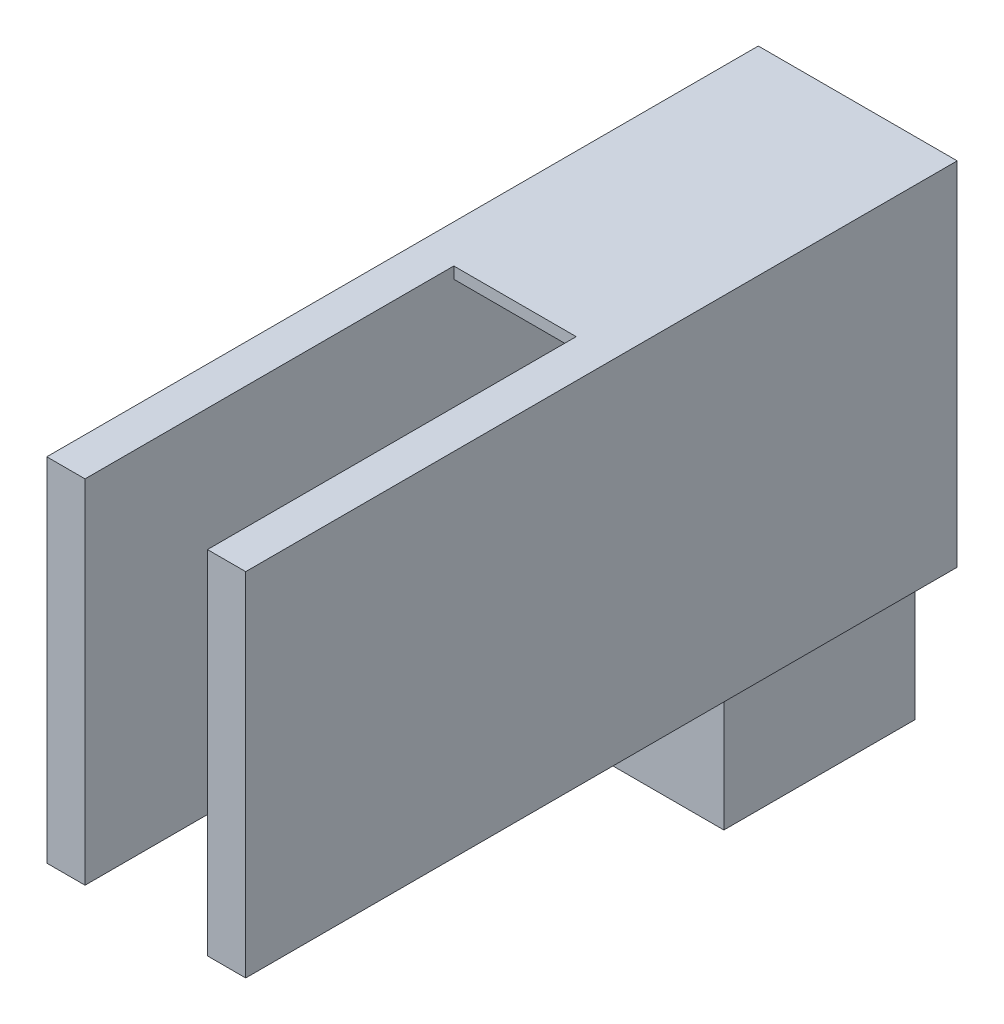
ISO-10303-21;
HEADER;
FILE_DESCRIPTION(('STEP AP214'),'2;1');
FILE_NAME('part.step','',(''),(''),'','','');
FILE_SCHEMA(('AUTOMOTIVE_DESIGN { 1 0 10303 214 1 1 1 1 }'));
ENDSEC;
DATA;
#1=APPLICATION_CONTEXT('core data for automotive mechanical design processes');
#2=APPLICATION_PROTOCOL_DEFINITION('international standard','automotive_design',2000,#1);
#3=PRODUCT_CONTEXT('',#1,'mechanical');
#4=PRODUCT('Part','Part','',(#3));
#5=PRODUCT_RELATED_PRODUCT_CATEGORY('part','',(#4));
#6=PRODUCT_DEFINITION_FORMATION('','',#4);
#7=PRODUCT_DEFINITION_CONTEXT('part definition',#1,'design');
#8=PRODUCT_DEFINITION('design','',#6,#7);
#9=PRODUCT_DEFINITION_SHAPE('','',#8);
#10=(LENGTH_UNIT() NAMED_UNIT(*) SI_UNIT(.MILLI.,.METRE.));
#11=(NAMED_UNIT(*) PLANE_ANGLE_UNIT() SI_UNIT($,.RADIAN.));
#12=(NAMED_UNIT(*) SI_UNIT($,.STERADIAN.) SOLID_ANGLE_UNIT());
#13=UNCERTAINTY_MEASURE_WITH_UNIT(LENGTH_MEASURE(1.E-05),#10,'distance_accuracy_value','');
#14=(GEOMETRIC_REPRESENTATION_CONTEXT(3) GLOBAL_UNCERTAINTY_ASSIGNED_CONTEXT((#13)) GLOBAL_UNIT_ASSIGNED_CONTEXT((#10,
#11,#12)) REPRESENTATION_CONTEXT('',''));
#15=CARTESIAN_POINT('',(0.,0.,0.));
#16=DIRECTION('',(0.,0.,1.));
#17=DIRECTION('',(1.,0.,0.));
#18=AXIS2_PLACEMENT_3D('',#15,#16,#17);
#19=CARTESIAN_POINT('',(-13.,-23.,93.));
#20=DIRECTION('',(0.,1.,0.));
#21=DIRECTION('',(0.,0.,1.));
#22=AXIS2_PLACEMENT_3D('',#19,#20,#21);
#23=PLANE('',#22);
#24=DIRECTION('',(0.,0.,1.));
#25=VECTOR('',#24,1.);
#26=CARTESIAN_POINT('',(7.5,-23.,25.));
#27=LINE('',#26,#25);
#28=CARTESIAN_POINT('',(7.49999999999998,-23.,0.));
#29=VERTEX_POINT('',#28);
#30=CARTESIAN_POINT('',(7.5,-23.,20.));
#31=VERTEX_POINT('',#30);
#32=EDGE_CURVE('E51',#29,#31,#27,.T.);
#33=ORIENTED_EDGE('',*,*,#32,.F.);
#34=DIRECTION('',(1.,0.,0.));
#35=VECTOR('',#34,1.);
#36=CARTESIAN_POINT('',(-13.,-23.,0.));
#37=LINE('',#36,#35);
#38=CARTESIAN_POINT('',(13.,-23.,0.));
#39=VERTEX_POINT('',#38);
#40=EDGE_CURVE('E241',#29,#39,#37,.T.);
#41=ORIENTED_EDGE('',*,*,#40,.T.);
#42=DIRECTION('',(0.,0.,-1.));
#43=VECTOR('',#42,1.);
#44=CARTESIAN_POINT('',(13.,-23.,93.));
#45=LINE('',#44,#43);
#46=CARTESIAN_POINT('',(13.,-23.,93.));
#47=VERTEX_POINT('',#46);
#48=EDGE_CURVE('E234',#47,#39,#45,.T.);
#49=ORIENTED_EDGE('',*,*,#48,.F.);
#50=DIRECTION('',(1.,0.,0.));
#51=VECTOR('',#50,1.);
#52=CARTESIAN_POINT('',(-13.,-23.,93.));
#53=LINE('',#52,#51);
#54=CARTESIAN_POINT('',(7.99999999999999,-23.,93.));
#55=VERTEX_POINT('',#54);
#56=EDGE_CURVE('E230',#55,#47,#53,.T.);
#57=ORIENTED_EDGE('',*,*,#56,.F.);
#58=DIRECTION('',(0.,0.,-1.));
#59=VECTOR('',#58,1.);
#60=CARTESIAN_POINT('',(8.,-23.,93.));
#61=LINE('',#60,#59);
#62=CARTESIAN_POINT('',(8.,-23.,20.));
#63=VERTEX_POINT('',#62);
#64=EDGE_CURVE('E173',#55,#63,#61,.T.);
#65=ORIENTED_EDGE('',*,*,#64,.T.);
#66=DIRECTION('',(1.,0.,0.));
#67=VECTOR('',#66,1.);
#68=CARTESIAN_POINT('',(-8.,-23.,20.));
#69=LINE('',#68,#67);
#70=EDGE_CURVE('E195',#31,#63,#69,.T.);
#71=ORIENTED_EDGE('',*,*,#70,.F.);
#72=EDGE_LOOP('',(#33,#41,#49,#57,#65,#71));
#73=FACE_BOUND('',#72,.T.);
#74=ADVANCED_FACE('F33',(#73),#23,.F.);
#75=CARTESIAN_POINT('',(0.,0.,93.));
#76=DIRECTION('',(0.,0.,1.));
#77=DIRECTION('',(1.,0.,0.));
#78=AXIS2_PLACEMENT_3D('',#75,#76,#77);
#79=PLANE('',#78);
#80=DIRECTION('',(-1.,0.,0.));
#81=VECTOR('',#80,1.);
#82=CARTESIAN_POINT('',(-13.,23.,93.));
#83=LINE('',#82,#81);
#84=CARTESIAN_POINT('',(13.,23.,93.));
#85=VERTEX_POINT('',#84);
#86=CARTESIAN_POINT('',(8.,23.,93.));
#87=VERTEX_POINT('',#86);
#88=EDGE_CURVE('E225',#85,#87,#83,.T.);
#89=ORIENTED_EDGE('',*,*,#88,.T.);
#90=DIRECTION('',(0.,-1.,0.));
#91=VECTOR('',#90,1.);
#92=CARTESIAN_POINT('',(8.,-23.,93.));
#93=LINE('',#92,#91);
#94=EDGE_CURVE('E170',#87,#55,#93,.T.);
#95=ORIENTED_EDGE('',*,*,#94,.T.);
#96=ORIENTED_EDGE('',*,*,#56,.T.);
#97=DIRECTION('',(0.,1.,0.));
#98=VECTOR('',#97,1.);
#99=CARTESIAN_POINT('',(13.,23.,93.));
#100=LINE('',#99,#98);
#101=EDGE_CURVE('E221',#47,#85,#100,.T.);
#102=ORIENTED_EDGE('',*,*,#101,.T.);
#103=EDGE_LOOP('',(#89,#95,#96,#102));
#104=FACE_BOUND('',#103,.T.);
#105=ADVANCED_FACE('F270',(#104),#79,.T.);
#106=CARTESIAN_POINT('',(13.,23.,93.));
#107=DIRECTION('',(-1.,0.,0.));
#108=DIRECTION('',(0.,-1.,0.));
#109=AXIS2_PLACEMENT_3D('',#106,#107,#108);
#110=PLANE('',#109);
#111=DIRECTION('',(0.,1.,0.));
#112=VECTOR('',#111,1.);
#113=CARTESIAN_POINT('',(13.,23.,0.));
#114=LINE('',#113,#112);
#115=CARTESIAN_POINT('',(13.,23.,0.));
#116=VERTEX_POINT('',#115);
#117=EDGE_CURVE('E212',#39,#116,#114,.T.);
#118=ORIENTED_EDGE('',*,*,#117,.T.);
#119=DIRECTION('',(0.,0.,-1.));
#120=VECTOR('',#119,1.);
#121=CARTESIAN_POINT('',(13.,23.,93.));
#122=LINE('',#121,#120);
#123=EDGE_CURVE('E11',#85,#116,#122,.T.);
#124=ORIENTED_EDGE('',*,*,#123,.F.);
#125=ORIENTED_EDGE('',*,*,#101,.F.);
#126=ORIENTED_EDGE('',*,*,#48,.T.);
#127=EDGE_LOOP('',(#118,#124,#125,#126));
#128=FACE_BOUND('',#127,.T.);
#129=ADVANCED_FACE('F35',(#128),#110,.F.);
#130=CARTESIAN_POINT('',(-13.,23.,93.));
#131=DIRECTION('',(0.,-1.,0.));
#132=DIRECTION('',(0.,0.,-1.));
#133=AXIS2_PLACEMENT_3D('',#130,#131,#132);
#134=PLANE('',#133);
#135=CARTESIAN_POINT('',(-8.,23.,93.));
#136=VERTEX_POINT('',#135);
#137=CARTESIAN_POINT('',(-13.,23.,93.));
#138=VERTEX_POINT('',#137);
#139=EDGE_CURVE('E224',#136,#138,#83,.T.);
#140=ORIENTED_EDGE('',*,*,#139,.F.);
#141=DIRECTION('',(0.,0.,1.));
#142=VECTOR('',#141,1.);
#143=CARTESIAN_POINT('',(-8.,23.,93.));
#144=LINE('',#143,#142);
#145=CARTESIAN_POINT('',(-8.,23.,44.8));
#146=VERTEX_POINT('',#145);
#147=EDGE_CURVE('E194',#146,#136,#144,.T.);
#148=ORIENTED_EDGE('',*,*,#147,.F.);
#149=DIRECTION('',(1.,0.,0.));
#150=VECTOR('',#149,1.);
#151=CARTESIAN_POINT('',(-8.,23.,44.8));
#152=LINE('',#151,#150);
#153=CARTESIAN_POINT('',(8.,23.,44.8));
#154=VERTEX_POINT('',#153);
#155=EDGE_CURVE('E209',#146,#154,#152,.T.);
#156=ORIENTED_EDGE('',*,*,#155,.T.);
#157=DIRECTION('',(0.,0.,1.));
#158=VECTOR('',#157,1.);
#159=CARTESIAN_POINT('',(8.,23.,93.));
#160=LINE('',#159,#158);
#161=EDGE_CURVE('E182',#154,#87,#160,.T.);
#162=ORIENTED_EDGE('',*,*,#161,.T.);
#163=ORIENTED_EDGE('',*,*,#88,.F.);
#164=ORIENTED_EDGE('',*,*,#123,.T.);
#165=DIRECTION('',(-1.,0.,0.));
#166=VECTOR('',#165,1.);
#167=CARTESIAN_POINT('',(-13.,23.,0.));
#168=LINE('',#167,#166);
#169=CARTESIAN_POINT('',(-13.,23.,0.));
#170=VERTEX_POINT('',#169);
#171=EDGE_CURVE('E237',#116,#170,#168,.T.);
#172=ORIENTED_EDGE('',*,*,#171,.T.);
#173=DIRECTION('',(0.,0.,-1.));
#174=VECTOR('',#173,1.);
#175=CARTESIAN_POINT('',(-13.,23.,93.));
#176=LINE('',#175,#174);
#177=EDGE_CURVE('E43',#138,#170,#176,.T.);
#178=ORIENTED_EDGE('',*,*,#177,.F.);
#179=EDGE_LOOP('',(#140,#148,#156,#162,#163,#164,#172,#178));
#180=FACE_BOUND('',#179,.T.);
#181=ADVANCED_FACE('F267',(#180),#134,.F.);
#182=CARTESIAN_POINT('',(-13.,23.,93.));
#183=DIRECTION('',(1.,0.,0.));
#184=DIRECTION('',(0.,1.,0.));
#185=AXIS2_PLACEMENT_3D('',#182,#183,#184);
#186=PLANE('',#185);
#187=DIRECTION('',(0.,-1.,0.));
#188=VECTOR('',#187,1.);
#189=CARTESIAN_POINT('',(-13.,23.,0.));
#190=LINE('',#189,#188);
#191=CARTESIAN_POINT('',(-13.,-23.,0.));
#192=VERTEX_POINT('',#191);
#193=EDGE_CURVE('E239',#170,#192,#190,.T.);
#194=ORIENTED_EDGE('',*,*,#193,.T.);
#195=DIRECTION('',(0.,0.,-1.));
#196=VECTOR('',#195,1.);
#197=CARTESIAN_POINT('',(-13.,-23.,93.));
#198=LINE('',#197,#196);
#199=CARTESIAN_POINT('',(-13.,-23.,93.));
#200=VERTEX_POINT('',#199);
#201=EDGE_CURVE('E251',#200,#192,#198,.T.);
#202=ORIENTED_EDGE('',*,*,#201,.F.);
#203=DIRECTION('',(0.,-1.,0.));
#204=VECTOR('',#203,1.);
#205=CARTESIAN_POINT('',(-13.,23.,93.));
#206=LINE('',#205,#204);
#207=EDGE_CURVE('E228',#138,#200,#206,.T.);
#208=ORIENTED_EDGE('',*,*,#207,.F.);
#209=ORIENTED_EDGE('',*,*,#177,.T.);
#210=EDGE_LOOP('',(#194,#202,#208,#209));
#211=FACE_BOUND('',#210,.T.);
#212=ADVANCED_FACE('F309',(#211),#186,.F.);
#213=CARTESIAN_POINT('',(-7.5,-23.,0.));
#214=VERTEX_POINT('',#213);
#215=EDGE_CURVE('E59',#192,#214,#37,.T.);
#216=ORIENTED_EDGE('',*,*,#215,.T.);
#217=DIRECTION('',(0.,0.,1.));
#218=VECTOR('',#217,1.);
#219=CARTESIAN_POINT('',(-7.5,-23.,25.));
#220=LINE('',#219,#218);
#221=CARTESIAN_POINT('',(-7.5,-23.,20.));
#222=VERTEX_POINT('',#221);
#223=EDGE_CURVE('E37',#214,#222,#220,.T.);
#224=ORIENTED_EDGE('',*,*,#223,.T.);
#225=CARTESIAN_POINT('',(-8.,-23.,20.));
#226=VERTEX_POINT('',#225);
#227=EDGE_CURVE('E217',#226,#222,#69,.T.);
#228=ORIENTED_EDGE('',*,*,#227,.F.);
#229=DIRECTION('',(0.,0.,-1.));
#230=VECTOR('',#229,1.);
#231=CARTESIAN_POINT('',(-8.,-23.,93.));
#232=LINE('',#231,#230);
#233=CARTESIAN_POINT('',(-8.,-23.,93.));
#234=VERTEX_POINT('',#233);
#235=EDGE_CURVE('E181',#234,#226,#232,.T.);
#236=ORIENTED_EDGE('',*,*,#235,.F.);
#237=EDGE_CURVE('E231',#200,#234,#53,.T.);
#238=ORIENTED_EDGE('',*,*,#237,.F.);
#239=ORIENTED_EDGE('',*,*,#201,.T.);
#240=EDGE_LOOP('',(#216,#224,#228,#236,#238,#239));
#241=FACE_BOUND('',#240,.T.);
#242=ADVANCED_FACE('F301',(#241),#23,.F.);
#243=DIRECTION('',(0.,-1.,0.));
#244=VECTOR('',#243,1.);
#245=CARTESIAN_POINT('',(-8.,-23.,93.));
#246=LINE('',#245,#244);
#247=EDGE_CURVE('E179',#136,#234,#246,.T.);
#248=ORIENTED_EDGE('',*,*,#247,.F.);
#249=ORIENTED_EDGE('',*,*,#139,.T.);
#250=ORIENTED_EDGE('',*,*,#207,.T.);
#251=ORIENTED_EDGE('',*,*,#237,.T.);
#252=EDGE_LOOP('',(#248,#249,#250,#251));
#253=FACE_BOUND('',#252,.T.);
#254=ADVANCED_FACE('F306',(#253),#79,.T.);
#255=CARTESIAN_POINT('',(0.,0.,0.));
#256=DIRECTION('',(0.,0.,1.));
#257=DIRECTION('',(1.,0.,0.));
#258=AXIS2_PLACEMENT_3D('',#255,#256,#257);
#259=PLANE('',#258);
#260=ORIENTED_EDGE('',*,*,#117,.F.);
#261=ORIENTED_EDGE('',*,*,#40,.F.);
#262=DIRECTION('',(0.,1.,0.));
#263=VECTOR('',#262,1.);
#264=CARTESIAN_POINT('',(7.5,-23.,0.));
#265=LINE('',#264,#263);
#266=CARTESIAN_POINT('',(7.5,-43.,0.));
#267=VERTEX_POINT('',#266);
#268=EDGE_CURVE('E156',#267,#29,#265,.T.);
#269=ORIENTED_EDGE('',*,*,#268,.F.);
#270=DIRECTION('',(-1.,0.,0.));
#271=VECTOR('',#270,1.);
#272=CARTESIAN_POINT('',(7.5,-43.,0.));
#273=LINE('',#272,#271);
#274=CARTESIAN_POINT('',(-7.5,-43.,0.));
#275=VERTEX_POINT('',#274);
#276=EDGE_CURVE('E152',#267,#275,#273,.T.);
#277=ORIENTED_EDGE('',*,*,#276,.T.);
#278=DIRECTION('',(0.,1.,0.));
#279=VECTOR('',#278,1.);
#280=CARTESIAN_POINT('',(-7.5,-23.,0.));
#281=LINE('',#280,#279);
#282=EDGE_CURVE('E289',#275,#214,#281,.T.);
#283=ORIENTED_EDGE('',*,*,#282,.T.);
#284=ORIENTED_EDGE('',*,*,#215,.F.);
#285=ORIENTED_EDGE('',*,*,#193,.F.);
#286=ORIENTED_EDGE('',*,*,#171,.F.);
#287=EDGE_LOOP('',(#260,#261,#269,#277,#283,#284,#285,#286));
#288=FACE_BOUND('',#287,.T.);
#289=ADVANCED_FACE('F262',(#288),#259,.F.);
#290=CARTESIAN_POINT('',(-8.,23.,44.8));
#291=DIRECTION('',(0.,0.,-1.));
#292=DIRECTION('',(-1.,0.,0.));
#293=AXIS2_PLACEMENT_3D('',#290,#291,#292);
#294=PLANE('',#293);
#295=DIRECTION('',(0.,1.,0.));
#296=VECTOR('',#295,1.);
#297=CARTESIAN_POINT('',(8.,23.,44.8));
#298=LINE('',#297,#296);
#299=CARTESIAN_POINT('',(8.,21.5,44.8));
#300=VERTEX_POINT('',#299);
#301=EDGE_CURVE('E205',#300,#154,#298,.T.);
#302=ORIENTED_EDGE('',*,*,#301,.T.);
#303=ORIENTED_EDGE('',*,*,#155,.F.);
#304=DIRECTION('',(0.,1.,0.));
#305=VECTOR('',#304,1.);
#306=CARTESIAN_POINT('',(-8.,23.,44.8));
#307=LINE('',#306,#305);
#308=CARTESIAN_POINT('',(-8.,21.5,44.8));
#309=VERTEX_POINT('',#308);
#310=EDGE_CURVE('E191',#309,#146,#307,.T.);
#311=ORIENTED_EDGE('',*,*,#310,.F.);
#312=DIRECTION('',(1.,0.,0.));
#313=VECTOR('',#312,1.);
#314=CARTESIAN_POINT('',(-8.,21.5,44.8));
#315=LINE('',#314,#313);
#316=EDGE_CURVE('E213',#309,#300,#315,.T.);
#317=ORIENTED_EDGE('',*,*,#316,.T.);
#318=EDGE_LOOP('',(#302,#303,#311,#317));
#319=FACE_BOUND('',#318,.T.);
#320=ADVANCED_FACE('F314',(#319),#294,.F.);
#321=CARTESIAN_POINT('',(-8.,21.5,44.8));
#322=DIRECTION('',(0.,1.,0.));
#323=DIRECTION('',(0.,0.,1.));
#324=AXIS2_PLACEMENT_3D('',#321,#322,#323);
#325=PLANE('',#324);
#326=DIRECTION('',(0.,0.,1.));
#327=VECTOR('',#326,1.);
#328=CARTESIAN_POINT('',(8.,21.5,44.8));
#329=LINE('',#328,#327);
#330=CARTESIAN_POINT('',(8.,21.5,20.));
#331=VERTEX_POINT('',#330);
#332=EDGE_CURVE('E202',#331,#300,#329,.T.);
#333=ORIENTED_EDGE('',*,*,#332,.T.);
#334=ORIENTED_EDGE('',*,*,#316,.F.);
#335=DIRECTION('',(0.,0.,1.));
#336=VECTOR('',#335,1.);
#337=CARTESIAN_POINT('',(-8.,21.5,44.8));
#338=LINE('',#337,#336);
#339=CARTESIAN_POINT('',(-8.,21.5,20.));
#340=VERTEX_POINT('',#339);
#341=EDGE_CURVE('E188',#340,#309,#338,.T.);
#342=ORIENTED_EDGE('',*,*,#341,.F.);
#343=DIRECTION('',(1.,0.,0.));
#344=VECTOR('',#343,1.);
#345=CARTESIAN_POINT('',(-8.,21.5,20.));
#346=LINE('',#345,#344);
#347=EDGE_CURVE('E215',#340,#331,#346,.T.);
#348=ORIENTED_EDGE('',*,*,#347,.T.);
#349=EDGE_LOOP('',(#333,#334,#342,#348));
#350=FACE_BOUND('',#349,.T.);
#351=ADVANCED_FACE('F316',(#350),#325,.F.);
#352=CARTESIAN_POINT('',(-8.,-23.,20.));
#353=DIRECTION('',(0.,0.,-1.));
#354=DIRECTION('',(-1.,0.,0.));
#355=AXIS2_PLACEMENT_3D('',#352,#353,#354);
#356=PLANE('',#355);
#357=DIRECTION('',(0.,1.,0.));
#358=VECTOR('',#357,1.);
#359=CARTESIAN_POINT('',(8.,-23.,20.));
#360=LINE('',#359,#358);
#361=EDGE_CURVE('E199',#63,#331,#360,.T.);
#362=ORIENTED_EDGE('',*,*,#361,.T.);
#363=ORIENTED_EDGE('',*,*,#347,.F.);
#364=DIRECTION('',(0.,1.,0.));
#365=VECTOR('',#364,1.);
#366=CARTESIAN_POINT('',(-8.,-23.,20.));
#367=LINE('',#366,#365);
#368=EDGE_CURVE('E185',#226,#340,#367,.T.);
#369=ORIENTED_EDGE('',*,*,#368,.F.);
#370=ORIENTED_EDGE('',*,*,#227,.T.);
#371=EDGE_CURVE('E220',#222,#31,#69,.T.);
#372=ORIENTED_EDGE('',*,*,#371,.T.);
#373=ORIENTED_EDGE('',*,*,#70,.T.);
#374=EDGE_LOOP('',(#362,#363,#369,#370,#372,#373));
#375=FACE_BOUND('',#374,.T.);
#376=ADVANCED_FACE('F277',(#375),#356,.F.);
#377=CARTESIAN_POINT('',(-8.,0.,0.));
#378=DIRECTION('',(-1.,0.,0.));
#379=DIRECTION('',(0.,0.,1.));
#380=AXIS2_PLACEMENT_3D('',#377,#378,#379);
#381=PLANE('',#380);
#382=ORIENTED_EDGE('',*,*,#247,.T.);
#383=ORIENTED_EDGE('',*,*,#235,.T.);
#384=ORIENTED_EDGE('',*,*,#368,.T.);
#385=ORIENTED_EDGE('',*,*,#341,.T.);
#386=ORIENTED_EDGE('',*,*,#310,.T.);
#387=ORIENTED_EDGE('',*,*,#147,.T.);
#388=EDGE_LOOP('',(#382,#383,#384,#385,#386,#387));
#389=FACE_BOUND('',#388,.T.);
#390=ADVANCED_FACE('F311',(#389),#381,.F.);
#391=CARTESIAN_POINT('',(8.,0.,0.));
#392=DIRECTION('',(-1.,0.,0.));
#393=DIRECTION('',(0.,0.,1.));
#394=AXIS2_PLACEMENT_3D('',#391,#392,#393);
#395=PLANE('',#394);
#396=ORIENTED_EDGE('',*,*,#94,.F.);
#397=ORIENTED_EDGE('',*,*,#161,.F.);
#398=ORIENTED_EDGE('',*,*,#301,.F.);
#399=ORIENTED_EDGE('',*,*,#332,.F.);
#400=ORIENTED_EDGE('',*,*,#361,.F.);
#401=ORIENTED_EDGE('',*,*,#64,.F.);
#402=EDGE_LOOP('',(#396,#397,#398,#399,#400,#401));
#403=FACE_BOUND('',#402,.T.);
#404=ADVANCED_FACE('F273',(#403),#395,.T.);
#405=CARTESIAN_POINT('',(7.5,-23.,25.));
#406=DIRECTION('',(0.,0.,-1.));
#407=DIRECTION('',(0.,1.,0.));
#408=AXIS2_PLACEMENT_3D('',#405,#406,#407);
#409=PLANE('',#408);
#410=DIRECTION('',(0.,-1.,0.));
#411=VECTOR('',#410,1.);
#412=CARTESIAN_POINT('',(-7.5,-23.,25.));
#413=LINE('',#412,#411);
#414=CARTESIAN_POINT('',(-7.5,-23.,25.));
#415=VERTEX_POINT('',#414);
#416=CARTESIAN_POINT('',(-7.5,-43.,25.));
#417=VERTEX_POINT('',#416);
#418=EDGE_CURVE('E169',#415,#417,#413,.T.);
#419=ORIENTED_EDGE('',*,*,#418,.T.);
#420=DIRECTION('',(-1.,0.,0.));
#421=VECTOR('',#420,1.);
#422=CARTESIAN_POINT('',(7.5,-43.,25.));
#423=LINE('',#422,#421);
#424=CARTESIAN_POINT('',(7.5,-43.,25.));
#425=VERTEX_POINT('',#424);
#426=EDGE_CURVE('E149',#425,#417,#423,.T.);
#427=ORIENTED_EDGE('',*,*,#426,.F.);
#428=DIRECTION('',(0.,-1.,0.));
#429=VECTOR('',#428,1.);
#430=CARTESIAN_POINT('',(7.5,-23.,25.));
#431=LINE('',#430,#429);
#432=CARTESIAN_POINT('',(7.5,-23.,25.));
#433=VERTEX_POINT('',#432);
#434=EDGE_CURVE('E157',#433,#425,#431,.T.);
#435=ORIENTED_EDGE('',*,*,#434,.F.);
#436=DIRECTION('',(-1.,0.,0.));
#437=VECTOR('',#436,1.);
#438=CARTESIAN_POINT('',(7.5,-23.,25.));
#439=LINE('',#438,#437);
#440=EDGE_CURVE('E175',#433,#415,#439,.T.);
#441=ORIENTED_EDGE('',*,*,#440,.T.);
#442=EDGE_LOOP('',(#419,#427,#435,#441));
#443=FACE_BOUND('',#442,.T.);
#444=ADVANCED_FACE('F167',(#443),#409,.F.);
#445=CARTESIAN_POINT('',(7.5,-43.,25.));
#446=DIRECTION('',(0.,1.,0.));
#447=DIRECTION('',(0.,0.,1.));
#448=AXIS2_PLACEMENT_3D('',#445,#446,#447);
#449=PLANE('',#448);
#450=DIRECTION('',(0.,0.,-1.));
#451=VECTOR('',#450,1.);
#452=CARTESIAN_POINT('',(-7.5,-43.,25.));
#453=LINE('',#452,#451);
#454=EDGE_CURVE('E290',#417,#275,#453,.T.);
#455=ORIENTED_EDGE('',*,*,#454,.T.);
#456=ORIENTED_EDGE('',*,*,#276,.F.);
#457=DIRECTION('',(0.,0.,-1.));
#458=VECTOR('',#457,1.);
#459=CARTESIAN_POINT('',(7.5,-43.,25.));
#460=LINE('',#459,#458);
#461=EDGE_CURVE('E145',#425,#267,#460,.T.);
#462=ORIENTED_EDGE('',*,*,#461,.F.);
#463=ORIENTED_EDGE('',*,*,#426,.T.);
#464=EDGE_LOOP('',(#455,#456,#462,#463));
#465=FACE_BOUND('',#464,.T.);
#466=ADVANCED_FACE('F147',(#465),#449,.F.);
#467=CARTESIAN_POINT('',(7.5,-23.,25.));
#468=DIRECTION('',(0.,-1.,0.));
#469=DIRECTION('',(0.,0.,-1.));
#470=AXIS2_PLACEMENT_3D('',#467,#468,#469);
#471=PLANE('',#470);
#472=ORIENTED_EDGE('',*,*,#371,.F.);
#473=EDGE_CURVE('E284',#222,#415,#220,.T.);
#474=ORIENTED_EDGE('',*,*,#473,.T.);
#475=ORIENTED_EDGE('',*,*,#440,.F.);
#476=EDGE_CURVE('E162',#31,#433,#27,.T.);
#477=ORIENTED_EDGE('',*,*,#476,.F.);
#478=EDGE_LOOP('',(#472,#474,#475,#477));
#479=FACE_BOUND('',#478,.T.);
#480=ADVANCED_FACE('F283',(#479),#471,.F.);
#481=CARTESIAN_POINT('',(7.5,0.,0.));
#482=DIRECTION('',(1.,0.,0.));
#483=DIRECTION('',(0.,0.,-1.));
#484=AXIS2_PLACEMENT_3D('',#481,#482,#483);
#485=PLANE('',#484);
#486=ORIENTED_EDGE('',*,*,#434,.T.);
#487=ORIENTED_EDGE('',*,*,#461,.T.);
#488=ORIENTED_EDGE('',*,*,#268,.T.);
#489=ORIENTED_EDGE('',*,*,#32,.T.);
#490=ORIENTED_EDGE('',*,*,#476,.T.);
#491=EDGE_LOOP('',(#486,#487,#488,#489,#490));
#492=FACE_BOUND('',#491,.T.);
#493=ADVANCED_FACE('F160',(#492),#485,.T.);
#494=CARTESIAN_POINT('',(-7.5,0.,0.));
#495=DIRECTION('',(1.,0.,0.));
#496=DIRECTION('',(0.,0.,-1.));
#497=AXIS2_PLACEMENT_3D('',#494,#495,#496);
#498=PLANE('',#497);
#499=ORIENTED_EDGE('',*,*,#418,.F.);
#500=ORIENTED_EDGE('',*,*,#473,.F.);
#501=ORIENTED_EDGE('',*,*,#223,.F.);
#502=ORIENTED_EDGE('',*,*,#282,.F.);
#503=ORIENTED_EDGE('',*,*,#454,.F.);
#504=EDGE_LOOP('',(#499,#500,#501,#502,#503));
#505=FACE_BOUND('',#504,.T.);
#506=ADVANCED_FACE('F287',(#505),#498,.F.);
#507=CLOSED_SHELL('',(#74,#105,#129,#181,#212,#242,#254,#289,#320,#351,#376,#390,#404,#444,#466,
#480,#493,#506));
#508=MANIFOLD_SOLID_BREP('B2',#507);
#509=ADVANCED_BREP_SHAPE_REPRESENTATION('',(#18,#508),#14);
#510=SHAPE_DEFINITION_REPRESENTATION(#9,#509);
ENDSEC;
END-ISO-10303-21;
